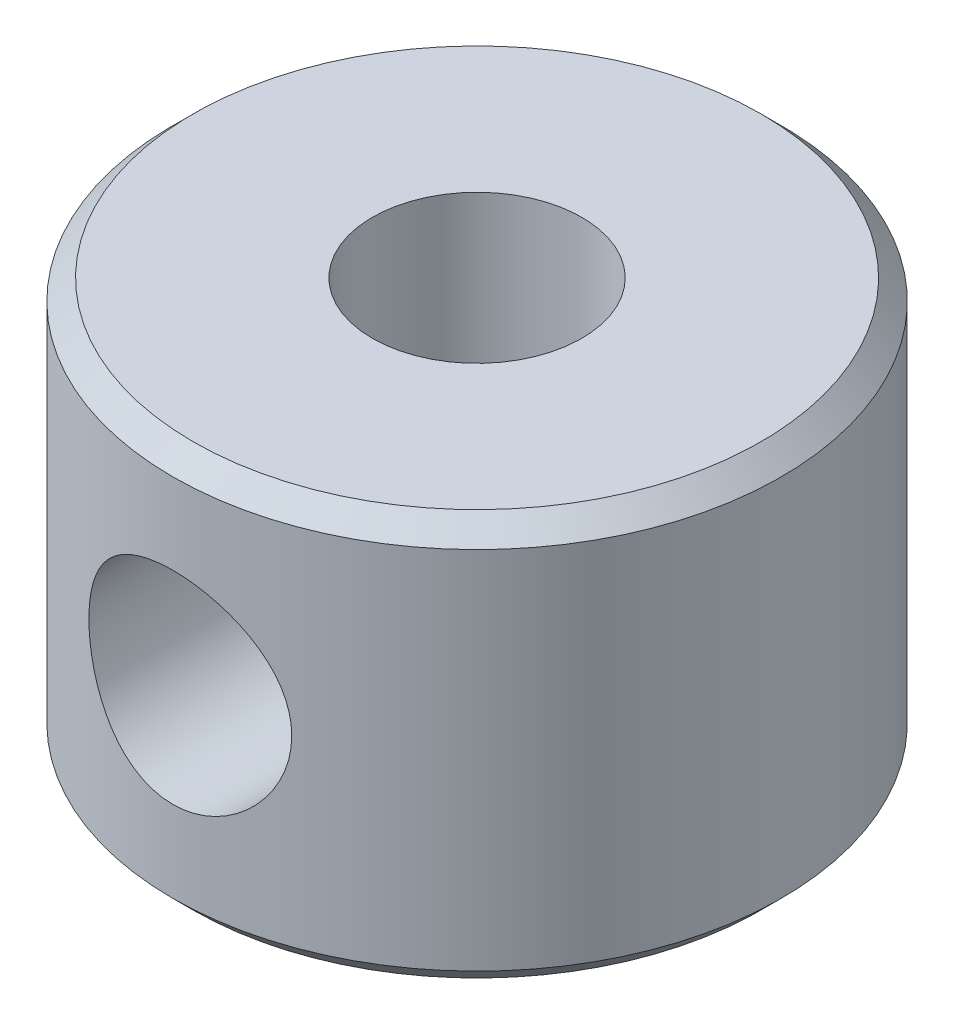
ISO-10303-21;
HEADER;
FILE_DESCRIPTION(('STEP AP214'),'2;1');
FILE_NAME('part.step','',(''),(''),'','','');
FILE_SCHEMA(('AUTOMOTIVE_DESIGN { 1 0 10303 214 1 1 1 1 }'));
ENDSEC;
DATA;
#1=APPLICATION_CONTEXT('core data for automotive mechanical design processes');
#2=APPLICATION_PROTOCOL_DEFINITION('international standard','automotive_design',2000,#1);
#3=PRODUCT_CONTEXT('',#1,'mechanical');
#4=PRODUCT('Part','Part','',(#3));
#5=PRODUCT_RELATED_PRODUCT_CATEGORY('part','',(#4));
#6=PRODUCT_DEFINITION_FORMATION('','',#4);
#7=PRODUCT_DEFINITION_CONTEXT('part definition',#1,'design');
#8=PRODUCT_DEFINITION('design','',#6,#7);
#9=PRODUCT_DEFINITION_SHAPE('','',#8);
#10=(LENGTH_UNIT() NAMED_UNIT(*) SI_UNIT(.MILLI.,.METRE.));
#11=(NAMED_UNIT(*) PLANE_ANGLE_UNIT() SI_UNIT($,.RADIAN.));
#12=(NAMED_UNIT(*) SI_UNIT($,.STERADIAN.) SOLID_ANGLE_UNIT());
#13=UNCERTAINTY_MEASURE_WITH_UNIT(LENGTH_MEASURE(1.E-05),#10,'distance_accuracy_value','');
#14=(GEOMETRIC_REPRESENTATION_CONTEXT(3) GLOBAL_UNCERTAINTY_ASSIGNED_CONTEXT((#13)) GLOBAL_UNIT_ASSIGNED_CONTEXT((#10,
#11,#12)) REPRESENTATION_CONTEXT('',''));
#15=CARTESIAN_POINT('',(0.,0.,0.));
#16=DIRECTION('',(0.,0.,1.));
#17=DIRECTION('',(1.,0.,0.));
#18=AXIS2_PLACEMENT_3D('',#15,#16,#17);
#19=CARTESIAN_POINT('',(0.,6.,0.));
#20=DIRECTION('',(0.,-1.,0.));
#21=DIRECTION('',(0.,0.,-1.));
#22=AXIS2_PLACEMENT_3D('',#19,#20,#21);
#23=CYLINDRICAL_SURFACE('',#22,4.5);
#24=CARTESIAN_POINT('',(1.50124176262911,3.00389897698696,4.24220145327143));
#25=CARTESIAN_POINT('',(1.50124214947188,2.92219671473285,4.24220118399541));
#26=CARTESIAN_POINT('',(1.49454463678661,2.84049677725157,4.24458926587543));
#27=CARTESIAN_POINT('',(1.46802186363171,2.67951734549558,4.25383410138035));
#28=CARTESIAN_POINT('',(1.44819444069861,2.60023825217825,4.26069159110263));
#29=CARTESIAN_POINT('',(1.39618546920662,2.44645863749103,4.27801457314271));
#30=CARTESIAN_POINT('',(1.3640281326,2.37194908282288,4.28847299032623));
#31=CARTESIAN_POINT('',(1.2883545706652,2.22935890416502,4.31180991166876));
#32=CARTESIAN_POINT('',(1.24483583914168,2.16127970315651,4.32468894961359));
#33=CARTESIAN_POINT('',(1.14585060002929,2.03081903347949,4.3519821354591));
#34=CARTESIAN_POINT('',(1.09001462028522,1.96872583397937,4.36643456090541));
#35=CARTESIAN_POINT('',(0.968767942920681,1.85458877515,4.39492460054389));
#36=CARTESIAN_POINT('',(0.903355710685376,1.8025465296134,4.40896214781679));
#37=CARTESIAN_POINT('',(0.762705067290401,1.70868063099257,4.43548494898627));
#38=CARTESIAN_POINT('',(0.687254808747116,1.66715902106002,4.44792014561264));
#39=CARTESIAN_POINT('',(0.529955053580342,1.59751159929569,4.4693888744321));
#40=CARTESIAN_POINT('',(0.448107288519685,1.5693821772216,4.47842332325512));
#41=CARTESIAN_POINT('',(0.283357995444474,1.52829519503837,4.49180338461121));
#42=CARTESIAN_POINT('',(0.20059221454531,1.51484380760145,4.49630120064894));
#43=CARTESIAN_POINT('',(0.033864158621567,1.50192453694597,4.50064440398129));
#44=CARTESIAN_POINT('',(-0.050097802431454,1.50245304950833,4.50049099042824));
#45=CARTESIAN_POINT('',(-0.213339397917929,1.51716535883601,4.49565323160284));
#46=CARTESIAN_POINT('',(-0.292673520443317,1.53081276969872,4.49114682966481));
#47=CARTESIAN_POINT('',(-0.447854362245978,1.57048844845764,4.47833578953493));
#48=CARTESIAN_POINT('',(-0.523700844785144,1.59651755545659,4.4700308939221));
#49=CARTESIAN_POINT('',(-0.670926122689455,1.66053095294615,4.4503316260564));
#50=CARTESIAN_POINT('',(-0.742233091549294,1.69866788480712,4.43889808068117));
#51=CARTESIAN_POINT('',(-0.877594502971263,1.78568853515954,4.41413295781137));
#52=CARTESIAN_POINT('',(-0.941646921327302,1.83457524197692,4.40080085290083));
#53=CARTESIAN_POINT('',(-1.0638713901266,1.94441056717806,4.372904461735));
#54=CARTESIAN_POINT('',(-1.12162459969139,2.00581871375512,4.35831171538205));
#55=CARTESIAN_POINT('',(-1.22614852461176,2.13757206557094,4.33006910955843));
#56=CARTESIAN_POINT('',(-1.27291754742131,2.20791864555681,4.31641939562743));
#57=CARTESIAN_POINT('',(-1.35472512581371,2.35687941541008,4.29145459081226));
#58=CARTESIAN_POINT('',(-1.38958694160845,2.43559717403868,4.28017555748087));
#59=CARTESIAN_POINT('',(-1.44541746150855,2.59825606838635,4.26164802145092));
#60=CARTESIAN_POINT('',(-1.46639198823236,2.68219499881969,4.25439782975762));
#61=CARTESIAN_POINT('',(-1.49299943107514,2.84885651008789,4.24513172940927));
#62=CARTESIAN_POINT('',(-1.49928180632833,2.93146311410554,4.24289442836951));
#63=CARTESIAN_POINT('',(-1.49816620596261,3.09656320066251,4.24328877806353));
#64=CARTESIAN_POINT('',(-1.49077071509028,3.1790567010241,4.24591954445518));
#65=CARTESIAN_POINT('',(-1.4630929396065,3.3386344255537,4.25553270299241));
#66=CARTESIAN_POINT('',(-1.44326205330628,3.41580712221292,4.26236250902494));
#67=CARTESIAN_POINT('',(-1.39181825657429,3.56571438634603,4.27943587554494));
#68=CARTESIAN_POINT('',(-1.36020325744263,3.63844816437321,4.2896800411837));
#69=CARTESIAN_POINT('',(-1.28494919491618,3.77996960825737,4.31282945511777));
#70=CARTESIAN_POINT('',(-1.2409605603884,3.84855894094964,4.32580880118708));
#71=CARTESIAN_POINT('',(-1.14260441791858,3.97761805556256,4.35282115934385));
#72=CARTESIAN_POINT('',(-1.0882338504283,4.03808543497879,4.36685448129581));
#73=CARTESIAN_POINT('',(-0.967551116461852,4.15219095312291,4.39520897141545));
#74=CARTESIAN_POINT('',(-0.90079027419981,4.20536056201523,4.40951150513666));
#75=CARTESIAN_POINT('',(-0.75894250956503,4.29977319050902,4.4361251077651));
#76=CARTESIAN_POINT('',(-0.68385588305713,4.34101663373059,4.44843624740027));
#77=CARTESIAN_POINT('',(-0.527861551982676,4.41002913427953,4.46962078444169));
#78=CARTESIAN_POINT('',(-0.446995836069922,4.43788589270905,4.47851647822311));
#79=CARTESIAN_POINT('',(-0.281372907323191,4.47949059007711,4.49196171323399));
#80=CARTESIAN_POINT('',(-0.196617110738027,4.49324362180771,4.49651282323197));
#81=CARTESIAN_POINT('',(-0.0299056623342992,4.50579209339542,4.50063689476723));
#82=CARTESIAN_POINT('',(0.0519943713907935,4.50526015788552,4.50043377530143));
#83=CARTESIAN_POINT('',(0.214482601078425,4.49091301476734,4.4956203610117));
#84=CARTESIAN_POINT('',(0.295070902923798,4.4770988847578,4.49101042371782));
#85=CARTESIAN_POINT('',(0.451373910041931,4.43702562512301,4.47798179836266));
#86=CARTESIAN_POINT('',(0.527145694395109,4.41096765395756,4.46962477059807));
#87=CARTESIAN_POINT('',(0.67327006494553,4.34733268034122,4.44996053409753));
#88=CARTESIAN_POINT('',(0.743621667971083,4.30975359419144,4.438652791753));
#89=CARTESIAN_POINT('',(0.879742967326112,4.22254470883395,4.41373071948798));
#90=CARTESIAN_POINT('',(0.945247317644565,4.1725209489145,4.40004660064719));
#91=CARTESIAN_POINT('',(1.06715129985485,4.06251289025267,4.37208266248187));
#92=CARTESIAN_POINT('',(1.12354801552049,4.00252541359287,4.35780265419058));
#93=CARTESIAN_POINT('',(1.2278800429134,3.87148494360653,4.32958998063868));
#94=CARTESIAN_POINT('',(1.27539771297006,3.800090710522,4.31569279400012));
#95=CARTESIAN_POINT('',(1.35772741014653,3.64989733663279,4.29050567491901));
#96=CARTESIAN_POINT('',(1.39254275713706,3.57110013744246,4.27921506150793));
#97=CARTESIAN_POINT('',(1.44701303326381,3.41195624096351,4.26109665288449));
#98=CARTESIAN_POINT('',(1.46728210475138,3.33184058169891,4.25409019955869));
#99=CARTESIAN_POINT('',(1.49439395735712,3.16911490128691,4.24464352371175));
#100=CARTESIAN_POINT('',(1.50124137150367,3.08650575087089,4.24220172552856));
#101=CARTESIAN_POINT('',(1.50124176262911,3.00389897698696,4.24220145327143));
#102=B_SPLINE_CURVE_WITH_KNOTS('',3,(#24,#25,#26,#27,#28,#29,#30,#31,#32,#33,#34,#35,#36,#37,
#38,#39,#40,#41,#42,#43,#44,#45,#46,#47,#48,#49,#50,#51,#52,#53,#54,#55,#56,#57,#58,#59,#60,#61,
#62,#63,#64,#65,#66,#67,#68,#69,#70,#71,#72,#73,#74,#75,#76,#77,#78,#79,#80,#81,#82,#83,#84,#85,
#86,#87,#88,#89,#90,#91,#92,#93,#94,#95,#96,#97,#98,#99,#100,#101),.UNSPECIFIED.,.T.,.F.,(4,2,2,
2,2,2,2,2,2,2,2,2,2,2,2,2,2,2,2,2,2,2,2,2,2,2,2,2,2,2,2,2,2,2,2,2,2,2,4),(0.,0.244800877199034,
0.489642082522745,0.734004941251241,0.978421749278162,1.23152006141352,1.48465897757982,
1.74440259215486,2.00407614580183,2.25471478147401,2.50528879953491,2.74603507238353,
2.98679766283855,3.23072482290502,3.47471987811033,3.73020261545876,3.98572469418159,
4.24488959763006,4.50394577031475,4.75131437043211,4.99863803752402,5.23746593649716,
5.4763361871697,5.72278286600124,5.96930228489742,6.2276821225319,6.4860527813285,
6.74270686782829,6.99926824502786,7.24377127013004,7.48825446011223,7.72885434057196,
7.96949776141415,8.21903279277502,8.46864756645499,8.72803354100768,8.98735167396851,
9.23494818240587,9.48245920782247),.UNSPECIFIED.);
#103=CARTESIAN_POINT('',(1.50124176262911,3.00389897698696,4.24220145327143));
#104=VERTEX_POINT('',#103);
#105=EDGE_CURVE('E54',#104,#104,#102,.T.);
#106=ORIENTED_EDGE('',*,*,#105,.T.);
#107=EDGE_LOOP('',(#106));
#108=FACE_BOUND('',#107,.T.);
#109=CARTESIAN_POINT('',(0.,0.300000000000002,0.));
#110=DIRECTION('',(0.,1.,0.));
#111=DIRECTION('',(0.,0.,1.));
#112=AXIS2_PLACEMENT_3D('',#109,#110,#111);
#113=CIRCLE('',#112,4.5);
#114=CARTESIAN_POINT('',(0.,0.300000000000002,4.5));
#115=VERTEX_POINT('',#114);
#116=EDGE_CURVE('E37',#115,#115,#113,.T.);
#117=ORIENTED_EDGE('',*,*,#116,.T.);
#118=EDGE_LOOP('',(#117));
#119=FACE_BOUND('',#118,.T.);
#120=CARTESIAN_POINT('',(0.,5.7,0.));
#121=DIRECTION('',(0.,1.,0.));
#122=DIRECTION('',(0.,0.,1.));
#123=AXIS2_PLACEMENT_3D('',#120,#121,#122);
#124=CIRCLE('',#123,4.5);
#125=CARTESIAN_POINT('',(0.,5.7,4.5));
#126=VERTEX_POINT('',#125);
#127=EDGE_CURVE('E41',#126,#126,#124,.F.);
#128=ORIENTED_EDGE('',*,*,#127,.T.);
#129=EDGE_LOOP('',(#128));
#130=FACE_BOUND('',#129,.T.);
#131=ADVANCED_FACE('F30',(#108,#119,#130),#23,.T.);
#132=CARTESIAN_POINT('',(0.,6.,0.));
#133=DIRECTION('',(0.,1.,0.));
#134=DIRECTION('',(0.,0.,1.));
#135=AXIS2_PLACEMENT_3D('',#132,#133,#134);
#136=PLANE('',#135);
#137=CARTESIAN_POINT('',(0.,6.,0.));
#138=DIRECTION('',(0.,1.,0.));
#139=DIRECTION('',(0.,0.,1.));
#140=AXIS2_PLACEMENT_3D('',#137,#138,#139);
#141=CIRCLE('',#140,1.55);
#142=CARTESIAN_POINT('',(0.,6.,1.55));
#143=VERTEX_POINT('',#142);
#144=EDGE_CURVE('E51',#143,#143,#141,.T.);
#145=ORIENTED_EDGE('',*,*,#144,.F.);
#146=EDGE_LOOP('',(#145));
#147=FACE_BOUND('',#146,.T.);
#148=CARTESIAN_POINT('',(0.,6.,0.));
#149=DIRECTION('',(0.,1.,0.));
#150=DIRECTION('',(0.,0.,1.));
#151=AXIS2_PLACEMENT_3D('',#148,#149,#150);
#152=CIRCLE('',#151,4.2);
#153=CARTESIAN_POINT('',(0.,6.,4.2));
#154=VERTEX_POINT('',#153);
#155=EDGE_CURVE('E45',#154,#154,#152,.T.);
#156=ORIENTED_EDGE('',*,*,#155,.T.);
#157=EDGE_LOOP('',(#156));
#158=FACE_BOUND('',#157,.T.);
#159=ADVANCED_FACE('F80',(#147,#158),#136,.T.);
#160=CARTESIAN_POINT('',(0.,0.,0.));
#161=DIRECTION('',(0.,1.,0.));
#162=DIRECTION('',(0.,0.,1.));
#163=AXIS2_PLACEMENT_3D('',#160,#161,#162);
#164=PLANE('',#163);
#165=CARTESIAN_POINT('',(0.,0.,0.));
#166=DIRECTION('',(0.,1.,0.));
#167=DIRECTION('',(0.,0.,1.));
#168=AXIS2_PLACEMENT_3D('',#165,#166,#167);
#169=CIRCLE('',#168,1.55);
#170=CARTESIAN_POINT('',(0.,0.,1.55));
#171=VERTEX_POINT('',#170);
#172=EDGE_CURVE('E50',#171,#171,#169,.T.);
#173=ORIENTED_EDGE('',*,*,#172,.T.);
#174=EDGE_LOOP('',(#173));
#175=FACE_BOUND('',#174,.T.);
#176=CARTESIAN_POINT('',(0.,0.,0.));
#177=DIRECTION('',(0.,1.,0.));
#178=DIRECTION('',(0.,0.,1.));
#179=AXIS2_PLACEMENT_3D('',#176,#177,#178);
#180=CIRCLE('',#179,4.2);
#181=CARTESIAN_POINT('',(0.,0.,4.2));
#182=VERTEX_POINT('',#181);
#183=EDGE_CURVE('E10',#182,#182,#180,.F.);
#184=ORIENTED_EDGE('',*,*,#183,.T.);
#185=EDGE_LOOP('',(#184));
#186=FACE_BOUND('',#185,.T.);
#187=ADVANCED_FACE('F82',(#175,#186),#164,.F.);
#188=CARTESIAN_POINT('',(0.,6.,0.));
#189=DIRECTION('',(0.,-1.,0.));
#190=DIRECTION('',(0.,0.,-1.));
#191=AXIS2_PLACEMENT_3D('',#188,#189,#190);
#192=CONICAL_SURFACE('',#191,4.2,0.78539816339745);
#193=ORIENTED_EDGE('',*,*,#127,.F.);
#194=EDGE_LOOP('',(#193));
#195=FACE_BOUND('',#194,.T.);
#196=ORIENTED_EDGE('',*,*,#155,.F.);
#197=EDGE_LOOP('',(#196));
#198=FACE_BOUND('',#197,.T.);
#199=ADVANCED_FACE('F85',(#195,#198),#192,.T.);
#200=CARTESIAN_POINT('',(0.,0.300000000000002,0.));
#201=DIRECTION('',(0.,1.,0.));
#202=DIRECTION('',(0.,0.,1.));
#203=AXIS2_PLACEMENT_3D('',#200,#201,#202);
#204=CONICAL_SURFACE('',#203,4.5,0.78539816339745);
#205=ORIENTED_EDGE('',*,*,#183,.F.);
#206=EDGE_LOOP('',(#205));
#207=FACE_BOUND('',#206,.T.);
#208=ORIENTED_EDGE('',*,*,#116,.F.);
#209=EDGE_LOOP('',(#208));
#210=FACE_BOUND('',#209,.T.);
#211=ADVANCED_FACE('F32',(#207,#210),#204,.T.);
#212=CARTESIAN_POINT('',(0.,0.,0.));
#213=DIRECTION('',(0.,1.,0.));
#214=DIRECTION('',(0.,0.,1.));
#215=AXIS2_PLACEMENT_3D('',#212,#213,#214);
#216=CYLINDRICAL_SURFACE('',#215,1.55);
#217=CARTESIAN_POINT('',(0.,1.50389904559764,1.55));
#218=CARTESIAN_POINT('',(0.0676255582412408,1.50388788210877,1.54999076480189));
#219=CARTESIAN_POINT('',(0.135364966210617,1.50847700311504,1.54552873401008));
#220=CARTESIAN_POINT('',(0.268618990714222,1.52652374967638,1.52803550310012));
#221=CARTESIAN_POINT('',(0.334126533725871,1.54000723064567,1.51497932049265));
#222=CARTESIAN_POINT('',(0.460477547456789,1.57469589415675,1.48145265343169));
#223=CARTESIAN_POINT('',(0.521351372187493,1.5958444224513,1.46103657357576));
#224=CARTESIAN_POINT('',(0.637827533307206,1.64459835268507,1.41408155696741));
#225=CARTESIAN_POINT('',(0.693430751782774,1.67220267149502,1.38754364732371));
#226=CARTESIAN_POINT('',(0.820502397459261,1.74503136976085,1.31774946805444));
#227=CARTESIAN_POINT('',(0.889164003098309,1.79284562488075,1.27209372267955));
#228=CARTESIAN_POINT('',(1.01509279759794,1.89621713613814,1.17408823361971));
#229=CARTESIAN_POINT('',(1.07232558400607,1.95179693902133,1.12171903576935));
#230=CARTESIAN_POINT('',(1.15893367392687,2.04977639420869,1.03050671573058));
#231=CARTESIAN_POINT('',(1.19132621399642,2.09061058626928,0.992779801199652));
#232=CARTESIAN_POINT('',(1.25127303310901,2.17464939249687,0.916070354672985));
#233=CARTESIAN_POINT('',(1.27882423420873,2.21785549189351,0.877087042407723));
#234=CARTESIAN_POINT('',(1.32919058570772,2.30642720004353,0.798698953000575));
#235=CARTESIAN_POINT('',(1.35201283048466,2.35178944658826,0.759294901824136));
#236=CARTESIAN_POINT('',(1.39308429657854,2.44491117435608,0.680997355068839));
#237=CARTESIAN_POINT('',(1.41133767157709,2.49266843044039,0.642103426437313));
#238=CARTESIAN_POINT('',(1.43791845632792,2.57487184509275,0.579340076770678));
#239=CARTESIAN_POINT('',(1.44752082214102,2.60840346743402,0.554810705757821));
#240=CARTESIAN_POINT('',(1.46463918355947,2.67749670996693,0.507885913778208));
#241=CARTESIAN_POINT('',(1.47215572232216,2.7130577987642,0.485489938266606));
#242=CARTESIAN_POINT('',(1.48287888470025,2.77557781737316,0.451425829633465));
#243=CARTESIAN_POINT('',(1.4866990134577,2.80177730545048,0.438586365360662));
#244=CARTESIAN_POINT('',(1.49303847826393,2.8557967691817,0.416495197103387));
#245=CARTESIAN_POINT('',(1.49556193291078,2.88361129774566,0.407232157001988));
#246=CARTESIAN_POINT('',(1.49863849640315,2.9338743922361,0.395740690459294));
#247=CARTESIAN_POINT('',(1.4995171679349,2.95602902836099,0.392364227234353));
#248=CARTESIAN_POINT('',(1.50027525659249,3.00059197492333,0.389457624181502));
#249=CARTESIAN_POINT('',(1.50015610837604,3.02299987490909,0.38992196206696));
#250=CARTESIAN_POINT('',(1.49893935141976,3.06728715267097,0.394569233640225));
#251=CARTESIAN_POINT('',(1.49784550490982,3.08916823071318,0.398737868970144));
#252=CARTESIAN_POINT('',(1.49478698877003,3.13209727663369,0.41005800378965));
#253=CARTESIAN_POINT('',(1.4928202929114,3.15314318117325,0.417216441501867));
#254=CARTESIAN_POINT('',(1.48440445025731,3.22715510036677,0.44666282142344));
#255=CARTESIAN_POINT('',(1.47581283571672,3.27741936338665,0.474855089883181));
#256=CARTESIAN_POINT('',(1.45463946939725,3.37395039026964,0.536307608904473));
#257=CARTESIAN_POINT('',(1.44202326192317,3.42017807372758,0.56961028381461));
#258=CARTESIAN_POINT('',(1.41169881722264,3.51407015521456,0.641290825100511));
#259=CARTESIAN_POINT('',(1.39363081012694,3.5614803043756,0.679854444008538));
#260=CARTESIAN_POINT('',(1.35300122446996,3.65392853516027,0.757508588459628));
#261=CARTESIAN_POINT('',(1.33043520953911,3.69896421895975,0.796599598394054));
#262=CARTESIAN_POINT('',(1.28078164410015,3.78670413962073,0.874192599296363));
#263=CARTESIAN_POINT('',(1.25370973510476,3.82941578600727,0.912696141550124));
#264=CARTESIAN_POINT('',(1.19485137825027,3.91253148286584,0.988500448379612));
#265=CARTESIAN_POINT('',(1.16306799035961,3.95293700768064,1.02580197462899));
#266=CARTESIAN_POINT('',(1.07890115768786,4.04909087581653,1.11524869790961));
#267=CARTESIAN_POINT('',(1.02374354250536,4.10340680275438,1.16638222312573));
#268=CARTESIAN_POINT('',(0.902528102630663,4.20487291002346,1.26250179608035));
#269=CARTESIAN_POINT('',(0.836484517357229,4.25203229872072,1.30749573601463));
#270=CARTESIAN_POINT('',(0.709248278294962,4.32743327766674,1.3797027046642));
#271=CARTESIAN_POINT('',(0.65016752170984,4.35755556484914,1.40865125660076));
#272=CARTESIAN_POINT('',(0.525960110794647,4.41044129777974,1.45957533922746));
#273=CARTESIAN_POINT('',(0.460837119176521,4.43320916463365,1.48155505907994));
#274=CARTESIAN_POINT('',(0.325251478060343,4.47000657978883,1.51712214415918));
#275=CARTESIAN_POINT('',(0.254746654984232,4.4839569709931,1.53063347736406));
#276=CARTESIAN_POINT('',(0.111289978200582,4.50153741304165,1.54768054384071));
#277=CARTESIAN_POINT('',(0.0383404222456524,4.50517689408357,1.55122539228147));
#278=CARTESIAN_POINT('',(-0.0968308810769937,4.50204963025814,1.54823885007208));
#279=CARTESIAN_POINT('',(-0.15912297012567,4.49667010524258,1.54305028153619));
#280=CARTESIAN_POINT('',(-0.28154730615702,4.47845279435997,1.52546885768584));
#281=CARTESIAN_POINT('',(-0.341679321402597,4.46561421079232,1.51307523183456));
#282=CARTESIAN_POINT('',(-0.458423444638977,4.43327905053671,1.48189314527466));
#283=CARTESIAN_POINT('',(-0.515031299577091,4.41377460663633,1.46309712839413));
#284=CARTESIAN_POINT('',(-0.623774492599295,4.36912670119232,1.42015127783385));
#285=CARTESIAN_POINT('',(-0.675908310282448,4.34398133311632,1.39599963407902));
#286=CARTESIAN_POINT('',(-0.799779193924125,4.2754773962311,1.33037336474921));
#287=CARTESIAN_POINT('',(-0.86852147407159,4.22924881880604,1.28622611814576));
#288=CARTESIAN_POINT('',(-0.994911589940556,4.12906282893107,1.19119540951517));
#289=CARTESIAN_POINT('',(-1.05252528065963,4.07508248872282,1.1402919995502));
#290=CARTESIAN_POINT('',(-1.17566498849153,3.94098093765128,1.01513294587473));
#291=CARTESIAN_POINT('',(-1.23666805775699,3.858408984016,0.939030037218134));
#292=CARTESIAN_POINT('',(-1.31420780012966,3.7283035935631,0.823120690433961));
#293=CARTESIAN_POINT('',(-1.33772521743171,3.68389873369517,0.784195803311612));
#294=CARTESIAN_POINT('',(-1.38027762234131,3.59279202823569,0.706596128151154));
#295=CARTESIAN_POINT('',(-1.39931604291793,3.54609197522585,0.667921170810305));
#296=CARTESIAN_POINT('',(-1.42799082568295,3.46393321885383,0.603487770716867));
#297=CARTESIAN_POINT('',(-1.43874505020415,3.42921277978661,0.57727881454247));
#298=CARTESIAN_POINT('',(-1.45798764122979,3.35773093778144,0.526777213276436));
#299=CARTESIAN_POINT('',(-1.46647575120449,3.32096930434379,0.502484785359607));
#300=CARTESIAN_POINT('',(-1.47882682971384,3.25573793338989,0.464592109790203));
#301=CARTESIAN_POINT('',(-1.4833159446155,3.22800670092173,0.44994777642634));
#302=CARTESIAN_POINT('',(-1.4908498215913,3.17070882685404,0.42431648463794));
#303=CARTESIAN_POINT('',(-1.4938991636988,3.14114834832305,0.413317962318718));
#304=CARTESIAN_POINT('',(-1.4976290128826,3.08894017989526,0.399555495183927));
#305=CARTESIAN_POINT('',(-1.4987368931772,3.06672241980141,0.395338243827371));
#306=CARTESIAN_POINT('',(-1.49994453411642,3.02188719634664,0.390734076690952));
#307=CARTESIAN_POINT('',(-1.50004642235843,2.99927067793018,0.390339077171749));
#308=CARTESIAN_POINT('',(-1.49923557613627,2.95437877203233,0.393438632176821));
#309=CARTESIAN_POINT('',(-1.49832447181037,2.93210289478527,0.396926937580792));
#310=CARTESIAN_POINT('',(-1.49558428798003,2.88834023718343,0.407131730404003));
#311=CARTESIAN_POINT('',(-1.49375276499463,2.86685572150792,0.413856808624648));
#312=CARTESIAN_POINT('',(-1.48624634588237,2.79601703865299,0.440373306166562));
#313=CARTESIAN_POINT('',(-1.47874780842862,2.74891605119125,0.465424199157881));
#314=CARTESIAN_POINT('',(-1.46026127945492,2.65844044732377,0.520591036753406));
#315=CARTESIAN_POINT('',(-1.44924491120893,2.61509991194014,0.550747199957463));
#316=CARTESIAN_POINT('',(-1.42293218738759,2.52745284449132,0.61570309903497));
#317=CARTESIAN_POINT('',(-1.40735863253138,2.48335930428839,0.650680798924521));
#318=CARTESIAN_POINT('',(-1.37245602059652,2.39731923528813,0.721409035529209));
#319=CARTESIAN_POINT('',(-1.35312352269098,2.35537471843209,0.757160253448788));
#320=CARTESIAN_POINT('',(-1.28951814379593,2.23254275513357,0.863989994744858));
#321=CARTESIAN_POINT('',(-1.23953752298321,2.15432873175138,0.934908622850179));
#322=CARTESIAN_POINT('',(-1.13254942247342,2.01753386024862,1.06093449879493));
#323=CARTESIAN_POINT('',(-1.07787804356589,1.95779869882908,1.11677580090462));
#324=CARTESIAN_POINT('',(-0.956377375755785,1.84568095430035,1.22241315083061));
#325=CARTESIAN_POINT('',(-0.889563656664374,1.79328910570507,1.27221680577702));
#326=CARTESIAN_POINT('',(-0.761443011395873,1.71009488489709,1.35163739858776));
#327=CARTESIAN_POINT('',(-0.702757104782016,1.67714196210774,1.38321677292241));
#328=CARTESIAN_POINT('',(-0.578747293224583,1.61852982067011,1.4395029274912));
#329=CARTESIAN_POINT('',(-0.513428651635924,1.59286487916417,1.4642150998395));
#330=CARTESIAN_POINT('',(-0.387325951419364,1.55360779665322,1.50205298005776));
#331=CARTESIAN_POINT('',(-0.327271138563079,1.53880042757727,1.5163432350257));
#332=CARTESIAN_POINT('',(-0.204634337384338,1.51668911361829,1.53768307479184));
#333=CARTESIAN_POINT('',(-0.142059835880917,1.50936443106234,1.5447526710627));
#334=CARTESIAN_POINT('',(-0.0528196361183463,1.50460983627706,1.54932765605698));
#335=CARTESIAN_POINT('',(-0.0264185055982444,1.50390340671053,1.55000360780952));
#336=CARTESIAN_POINT('',(0.,1.50389904559764,1.55));
#337=B_SPLINE_CURVE_WITH_KNOTS('',3,(#217,#218,#219,#220,#221,#222,#223,#224,#225,#226,#227,
#228,#229,#230,#231,#232,#233,#234,#235,#236,#237,#238,#239,#240,#241,#242,#243,#244,#245,#246,
#247,#248,#249,#250,#251,#252,#253,#254,#255,#256,#257,#258,#259,#260,#261,#262,#263,#264,#265,
#266,#267,#268,#269,#270,#271,#272,#273,#274,#275,#276,#277,#278,#279,#280,#281,#282,#283,#284,
#285,#286,#287,#288,#289,#290,#291,#292,#293,#294,#295,#296,#297,#298,#299,#300,#301,#302,#303,
#304,#305,#306,#307,#308,#309,#310,#311,#312,#313,#314,#315,#316,#317,#318,#319,#320,#321,#322,
#323,#324,#325,#326,#327,#328,#329,#330,#331,#332,#333,#334,#335,#336),.UNSPECIFIED.,.T.,.F.,(4,
2,2,2,2,2,2,2,2,2,2,2,2,2,2,2,2,2,2,2,2,2,2,2,2,2,2,2,2,2,2,2,2,2,2,2,2,2,2,2,2,2,2,2,2,2,2,2,2,
2,2,2,2,2,2,2,2,2,2,4),(0.,0.202782012653539,0.406156114602366,0.608056699998853,
0.809923435513001,1.09431500695068,1.37955014609142,1.57235306856709,1.76527812794461,
1.95791163162305,2.15036936569813,2.27820783277521,2.40601297892145,2.49411606602658,
2.58193755599557,2.64890779391862,2.71578175908922,2.78239871078474,2.84917112231466,
3.02258380964571,3.19752288197021,3.38843592118198,3.57953819737868,3.76999042217365,
3.96031949137372,4.23767680497235,4.51467415858026,4.73093166685458,4.9470589290548,
5.16509985712142,5.38294130387785,5.57024591116302,5.75757055321614,5.9451170483122,
6.13272702655501,6.41275856458341,6.6936361098443,7.07482785555482,7.26538486545,
7.45579534180774,7.59014709367178,7.72451404804173,7.81938928391796,7.91396064607406,
7.98158845509176,8.04907320567355,8.11644951473453,8.18400564345521,8.34435349587477,
8.50602893960593,8.68098233183147,8.85609663171267,9.20503783999667,9.49918127929837,
9.79295017365432,10.0151821267981,10.2372390875732,10.4268915803265,10.6160170284945,
10.6952355647379),.UNSPECIFIED.);
#338=CARTESIAN_POINT('',(0.,1.50389904559764,1.55));
#339=VERTEX_POINT('',#338);
#340=EDGE_CURVE('E63',#339,#339,#337,.T.);
#341=ORIENTED_EDGE('',*,*,#340,.T.);
#342=EDGE_LOOP('',(#341));
#343=FACE_BOUND('',#342,.T.);
#344=ORIENTED_EDGE('',*,*,#172,.F.);
#345=EDGE_LOOP('',(#344));
#346=FACE_BOUND('',#345,.T.);
#347=ORIENTED_EDGE('',*,*,#144,.T.);
#348=EDGE_LOOP('',(#347));
#349=FACE_BOUND('',#348,.T.);
#350=ADVANCED_FACE('F72',(#343,#346,#349),#216,.F.);
#351=CARTESIAN_POINT('',(0.00131715631684036,3.00389897698696,4.49999980723324));
#352=DIRECTION('',(0.000292701403742114,0.,0.999999957162943));
#353=DIRECTION('',(0.999999957162943,0.,-0.000292701403742114));
#354=AXIS2_PLACEMENT_3D('',#351,#352,#353);
#355=CYLINDRICAL_SURFACE('',#354,1.5);
#356=ORIENTED_EDGE('',*,*,#340,.F.);
#357=EDGE_LOOP('',(#356));
#358=FACE_BOUND('',#357,.T.);
#359=ORIENTED_EDGE('',*,*,#105,.F.);
#360=EDGE_LOOP('',(#359));
#361=FACE_BOUND('',#360,.T.);
#362=ADVANCED_FACE('F69',(#358,#361),#355,.F.);
#363=CLOSED_SHELL('',(#131,#159,#187,#199,#211,#350,#362));
#364=MANIFOLD_SOLID_BREP('B2',#363);
#365=ADVANCED_BREP_SHAPE_REPRESENTATION('',(#18,#364),#14);
#366=SHAPE_DEFINITION_REPRESENTATION(#9,#365);
ENDSEC;
END-ISO-10303-21;
